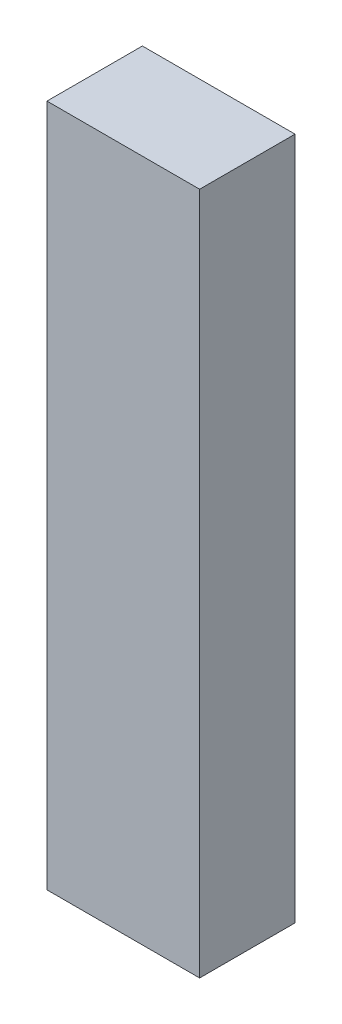
ISO-10303-21;
HEADER;
FILE_DESCRIPTION(('STEP AP214'),'2;1');
FILE_NAME('part.step','',(''),(''),'','','');
FILE_SCHEMA(('AUTOMOTIVE_DESIGN { 1 0 10303 214 1 1 1 1 }'));
ENDSEC;
DATA;
#1=APPLICATION_CONTEXT('core data for automotive mechanical design processes');
#2=APPLICATION_PROTOCOL_DEFINITION('international standard','automotive_design',2000,#1);
#3=PRODUCT_CONTEXT('',#1,'mechanical');
#4=PRODUCT('Part','Part','',(#3));
#5=PRODUCT_RELATED_PRODUCT_CATEGORY('part','',(#4));
#6=PRODUCT_DEFINITION_FORMATION('','',#4);
#7=PRODUCT_DEFINITION_CONTEXT('part definition',#1,'design');
#8=PRODUCT_DEFINITION('design','',#6,#7);
#9=PRODUCT_DEFINITION_SHAPE('','',#8);
#10=(LENGTH_UNIT() NAMED_UNIT(*) SI_UNIT(.MILLI.,.METRE.));
#11=(NAMED_UNIT(*) PLANE_ANGLE_UNIT() SI_UNIT($,.RADIAN.));
#12=(NAMED_UNIT(*) SI_UNIT($,.STERADIAN.) SOLID_ANGLE_UNIT());
#13=UNCERTAINTY_MEASURE_WITH_UNIT(LENGTH_MEASURE(1.E-05),#10,'distance_accuracy_value','');
#14=(GEOMETRIC_REPRESENTATION_CONTEXT(3) GLOBAL_UNCERTAINTY_ASSIGNED_CONTEXT((#13)) GLOBAL_UNIT_ASSIGNED_CONTEXT((#10,
#11,#12)) REPRESENTATION_CONTEXT('',''));
#15=CARTESIAN_POINT('',(0.,0.,0.));
#16=DIRECTION('',(0.,0.,1.));
#17=DIRECTION('',(1.,0.,0.));
#18=AXIS2_PLACEMENT_3D('',#15,#16,#17);
#19=CARTESIAN_POINT('',(1298.,1469.,-790.));
#20=DIRECTION('',(-1.,0.,0.));
#21=DIRECTION('',(0.,0.,1.));
#22=AXIS2_PLACEMENT_3D('',#19,#20,#21);
#23=PLANE('',#22);
#24=DIRECTION('',(0.,-1.,0.));
#25=VECTOR('',#24,1.);
#26=CARTESIAN_POINT('',(1298.,1469.,-765.));
#27=LINE('',#26,#25);
#28=CARTESIAN_POINT('',(1298.,1648.,-765.));
#29=VERTEX_POINT('',#28);
#30=CARTESIAN_POINT('',(1298.,1469.,-765.));
#31=VERTEX_POINT('',#30);
#32=EDGE_CURVE('E103',#29,#31,#27,.T.);
#33=ORIENTED_EDGE('',*,*,#32,.F.);
#34=DIRECTION('',(0.,0.,1.));
#35=VECTOR('',#34,1.);
#36=CARTESIAN_POINT('',(1298.,1648.,-790.));
#37=LINE('',#36,#35);
#38=CARTESIAN_POINT('',(1298.,1648.,-790.));
#39=VERTEX_POINT('',#38);
#40=EDGE_CURVE('E11',#39,#29,#37,.T.);
#41=ORIENTED_EDGE('',*,*,#40,.F.);
#42=DIRECTION('',(0.,-1.,0.));
#43=VECTOR('',#42,1.);
#44=CARTESIAN_POINT('',(1298.,1469.,-790.));
#45=LINE('',#44,#43);
#46=CARTESIAN_POINT('',(1298.,1469.,-790.));
#47=VERTEX_POINT('',#46);
#48=EDGE_CURVE('E97',#39,#47,#45,.T.);
#49=ORIENTED_EDGE('',*,*,#48,.T.);
#50=DIRECTION('',(0.,0.,1.));
#51=VECTOR('',#50,1.);
#52=CARTESIAN_POINT('',(1298.,1469.,-790.));
#53=LINE('',#52,#51);
#54=EDGE_CURVE('E42',#47,#31,#53,.T.);
#55=ORIENTED_EDGE('',*,*,#54,.T.);
#56=EDGE_LOOP('',(#33,#41,#49,#55));
#57=FACE_BOUND('',#56,.T.);
#58=ADVANCED_FACE('F39',(#57),#23,.T.);
#59=CARTESIAN_POINT('',(1298.,1648.,-790.));
#60=DIRECTION('',(0.,1.,0.));
#61=DIRECTION('',(0.,0.,1.));
#62=AXIS2_PLACEMENT_3D('',#59,#60,#61);
#63=PLANE('',#62);
#64=DIRECTION('',(-1.,0.,0.));
#65=VECTOR('',#64,1.);
#66=CARTESIAN_POINT('',(1298.,1648.,-765.));
#67=LINE('',#66,#65);
#68=CARTESIAN_POINT('',(1338.,1648.,-765.));
#69=VERTEX_POINT('',#68);
#70=EDGE_CURVE('E99',#69,#29,#67,.T.);
#71=ORIENTED_EDGE('',*,*,#70,.F.);
#72=DIRECTION('',(0.,0.,1.));
#73=VECTOR('',#72,1.);
#74=CARTESIAN_POINT('',(1338.,1648.,-790.));
#75=LINE('',#74,#73);
#76=CARTESIAN_POINT('',(1338.,1648.,-790.));
#77=VERTEX_POINT('',#76);
#78=EDGE_CURVE('E48',#77,#69,#75,.T.);
#79=ORIENTED_EDGE('',*,*,#78,.F.);
#80=DIRECTION('',(-1.,0.,0.));
#81=VECTOR('',#80,1.);
#82=CARTESIAN_POINT('',(1298.,1648.,-790.));
#83=LINE('',#82,#81);
#84=EDGE_CURVE('E94',#77,#39,#83,.T.);
#85=ORIENTED_EDGE('',*,*,#84,.T.);
#86=ORIENTED_EDGE('',*,*,#40,.T.);
#87=EDGE_LOOP('',(#71,#79,#85,#86));
#88=FACE_BOUND('',#87,.T.);
#89=ADVANCED_FACE('F113',(#88),#63,.T.);
#90=CARTESIAN_POINT('',(1338.,1469.,-790.));
#91=DIRECTION('',(1.,0.,0.));
#92=DIRECTION('',(0.,0.,-1.));
#93=AXIS2_PLACEMENT_3D('',#90,#91,#92);
#94=PLANE('',#93);
#95=DIRECTION('',(0.,1.,0.));
#96=VECTOR('',#95,1.);
#97=CARTESIAN_POINT('',(1338.,1469.,-765.));
#98=LINE('',#97,#96);
#99=CARTESIAN_POINT('',(1338.,1469.,-765.));
#100=VERTEX_POINT('',#99);
#101=EDGE_CURVE('E89',#100,#69,#98,.T.);
#102=ORIENTED_EDGE('',*,*,#101,.F.);
#103=DIRECTION('',(0.,0.,1.));
#104=VECTOR('',#103,1.);
#105=CARTESIAN_POINT('',(1338.,1469.,-790.));
#106=LINE('',#105,#104);
#107=CARTESIAN_POINT('',(1338.,1469.,-790.));
#108=VERTEX_POINT('',#107);
#109=EDGE_CURVE('E84',#108,#100,#106,.T.);
#110=ORIENTED_EDGE('',*,*,#109,.F.);
#111=DIRECTION('',(0.,1.,0.));
#112=VECTOR('',#111,1.);
#113=CARTESIAN_POINT('',(1338.,1469.,-790.));
#114=LINE('',#113,#112);
#115=EDGE_CURVE('E87',#108,#77,#114,.T.);
#116=ORIENTED_EDGE('',*,*,#115,.T.);
#117=ORIENTED_EDGE('',*,*,#78,.T.);
#118=EDGE_LOOP('',(#102,#110,#116,#117));
#119=FACE_BOUND('',#118,.T.);
#120=ADVANCED_FACE('F86',(#119),#94,.T.);
#121=CARTESIAN_POINT('',(1298.,1469.,-790.));
#122=DIRECTION('',(0.,-1.,0.));
#123=DIRECTION('',(0.,0.,-1.));
#124=AXIS2_PLACEMENT_3D('',#121,#122,#123);
#125=PLANE('',#124);
#126=DIRECTION('',(1.,0.,0.));
#127=VECTOR('',#126,1.);
#128=CARTESIAN_POINT('',(1298.,1469.,-765.));
#129=LINE('',#128,#127);
#130=EDGE_CURVE('E106',#31,#100,#129,.T.);
#131=ORIENTED_EDGE('',*,*,#130,.F.);
#132=ORIENTED_EDGE('',*,*,#54,.F.);
#133=DIRECTION('',(1.,0.,0.));
#134=VECTOR('',#133,1.);
#135=CARTESIAN_POINT('',(1298.,1469.,-790.));
#136=LINE('',#135,#134);
#137=EDGE_CURVE('E93',#47,#108,#136,.T.);
#138=ORIENTED_EDGE('',*,*,#137,.T.);
#139=ORIENTED_EDGE('',*,*,#109,.T.);
#140=EDGE_LOOP('',(#131,#132,#138,#139));
#141=FACE_BOUND('',#140,.T.);
#142=ADVANCED_FACE('F96',(#141),#125,.T.);
#143=CARTESIAN_POINT('',(0.,0.,-790.));
#144=DIRECTION('',(0.,0.,-1.));
#145=DIRECTION('',(-1.,0.,0.));
#146=AXIS2_PLACEMENT_3D('',#143,#144,#145);
#147=PLANE('',#146);
#148=ORIENTED_EDGE('',*,*,#48,.F.);
#149=ORIENTED_EDGE('',*,*,#84,.F.);
#150=ORIENTED_EDGE('',*,*,#115,.F.);
#151=ORIENTED_EDGE('',*,*,#137,.F.);
#152=EDGE_LOOP('',(#148,#149,#150,#151));
#153=FACE_BOUND('',#152,.T.);
#154=ADVANCED_FACE('F92',(#153),#147,.T.);
#155=CARTESIAN_POINT('',(0.,0.,-765.));
#156=DIRECTION('',(0.,0.,-1.));
#157=DIRECTION('',(-1.,0.,0.));
#158=AXIS2_PLACEMENT_3D('',#155,#156,#157);
#159=PLANE('',#158);
#160=ORIENTED_EDGE('',*,*,#32,.T.);
#161=ORIENTED_EDGE('',*,*,#130,.T.);
#162=ORIENTED_EDGE('',*,*,#101,.T.);
#163=ORIENTED_EDGE('',*,*,#70,.T.);
#164=EDGE_LOOP('',(#160,#161,#162,#163));
#165=FACE_BOUND('',#164,.T.);
#166=ADVANCED_FACE('F112',(#165),#159,.F.);
#167=CLOSED_SHELL('',(#58,#89,#120,#142,#154,#166));
#168=MANIFOLD_SOLID_BREP('B2',#167);
#169=ADVANCED_BREP_SHAPE_REPRESENTATION('',(#18,#168),#14);
#170=SHAPE_DEFINITION_REPRESENTATION(#9,#169);
ENDSEC;
END-ISO-10303-21;
